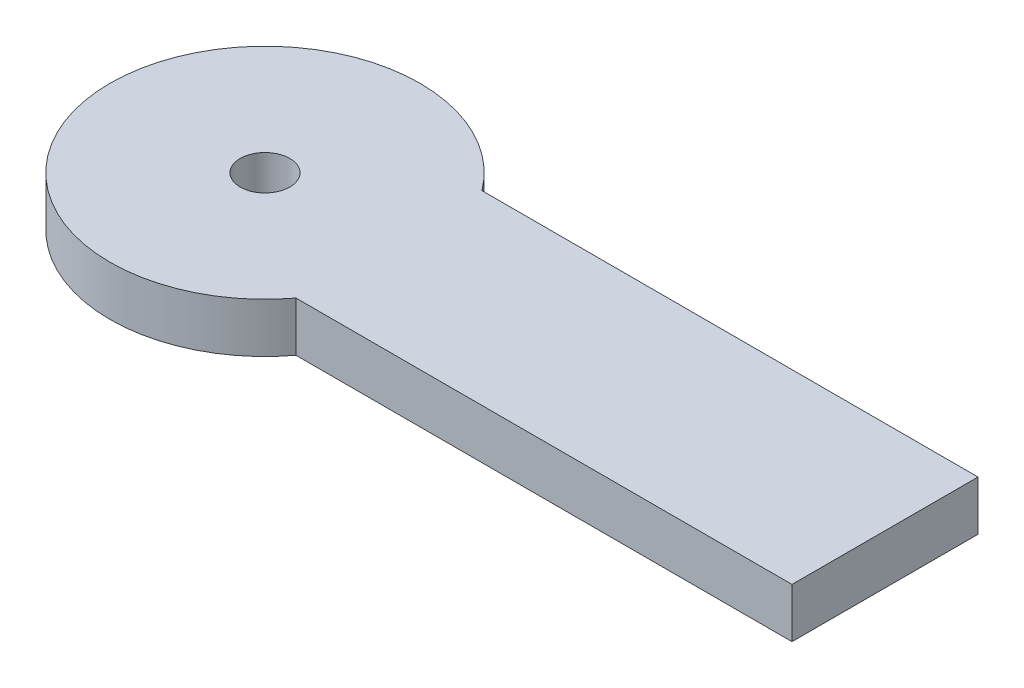
ISO-10303-21;
HEADER;
FILE_DESCRIPTION(('STEP AP214'),'2;1');
FILE_NAME('part.step','',(''),(''),'','','');
FILE_SCHEMA(('AUTOMOTIVE_DESIGN { 1 0 10303 214 1 1 1 1 }'));
ENDSEC;
DATA;
#1=APPLICATION_CONTEXT('core data for automotive mechanical design processes');
#2=APPLICATION_PROTOCOL_DEFINITION('international standard','automotive_design',2000,#1);
#3=PRODUCT_CONTEXT('',#1,'mechanical');
#4=PRODUCT('Part','Part','',(#3));
#5=PRODUCT_RELATED_PRODUCT_CATEGORY('part','',(#4));
#6=PRODUCT_DEFINITION_FORMATION('','',#4);
#7=PRODUCT_DEFINITION_CONTEXT('part definition',#1,'design');
#8=PRODUCT_DEFINITION('design','',#6,#7);
#9=PRODUCT_DEFINITION_SHAPE('','',#8);
#10=(LENGTH_UNIT() NAMED_UNIT(*) SI_UNIT(.MILLI.,.METRE.));
#11=(NAMED_UNIT(*) PLANE_ANGLE_UNIT() SI_UNIT($,.RADIAN.));
#12=(NAMED_UNIT(*) SI_UNIT($,.STERADIAN.) SOLID_ANGLE_UNIT());
#13=UNCERTAINTY_MEASURE_WITH_UNIT(LENGTH_MEASURE(1.E-05),#10,'distance_accuracy_value','');
#14=(GEOMETRIC_REPRESENTATION_CONTEXT(3) GLOBAL_UNCERTAINTY_ASSIGNED_CONTEXT((#13)) GLOBAL_UNIT_ASSIGNED_CONTEXT((#10,
#11,#12)) REPRESENTATION_CONTEXT('',''));
#15=CARTESIAN_POINT('',(0.,0.,0.));
#16=DIRECTION('',(0.,0.,1.));
#17=DIRECTION('',(1.,0.,0.));
#18=AXIS2_PLACEMENT_3D('',#15,#16,#17);
#19=CARTESIAN_POINT('',(0.,4.,0.));
#20=DIRECTION('',(0.,1.,0.));
#21=DIRECTION('',(0.,0.,1.));
#22=AXIS2_PLACEMENT_3D('',#19,#20,#21);
#23=PLANE('',#22);
#24=CARTESIAN_POINT('',(0.,4.,0.));
#25=DIRECTION('',(0.,1.,0.));
#26=DIRECTION('',(0.,0.,1.));
#27=AXIS2_PLACEMENT_3D('',#24,#25,#26);
#28=CIRCLE('',#27,12.5);
#29=CARTESIAN_POINT('',(10.,4.,-7.5));
#30=VERTEX_POINT('',#29);
#31=CARTESIAN_POINT('',(10.,4.,7.5));
#32=VERTEX_POINT('',#31);
#33=EDGE_CURVE('E87',#30,#32,#28,.T.);
#34=ORIENTED_EDGE('',*,*,#33,.T.);
#35=DIRECTION('',(1.,0.,0.));
#36=VECTOR('',#35,1.);
#37=CARTESIAN_POINT('',(50.,4.,7.5));
#38=LINE('',#37,#36);
#39=CARTESIAN_POINT('',(50.,4.,7.5));
#40=VERTEX_POINT('',#39);
#41=EDGE_CURVE('E82',#32,#40,#38,.T.);
#42=ORIENTED_EDGE('',*,*,#41,.T.);
#43=DIRECTION('',(0.,0.,-1.));
#44=VECTOR('',#43,1.);
#45=CARTESIAN_POINT('',(50.,4.,-7.5));
#46=LINE('',#45,#44);
#47=CARTESIAN_POINT('',(50.,4.,-7.5));
#48=VERTEX_POINT('',#47);
#49=EDGE_CURVE('E85',#40,#48,#46,.T.);
#50=ORIENTED_EDGE('',*,*,#49,.T.);
#51=DIRECTION('',(-1.,0.,0.));
#52=VECTOR('',#51,1.);
#53=CARTESIAN_POINT('',(10.,4.,-7.5));
#54=LINE('',#53,#52);
#55=EDGE_CURVE('E52',#48,#30,#54,.T.);
#56=ORIENTED_EDGE('',*,*,#55,.T.);
#57=EDGE_LOOP('',(#34,#42,#50,#56));
#58=FACE_BOUND('',#57,.T.);
#59=CARTESIAN_POINT('',(0.,4.,0.));
#60=DIRECTION('',(0.,1.,0.));
#61=DIRECTION('',(0.,0.,1.));
#62=AXIS2_PLACEMENT_3D('',#59,#60,#61);
#63=CIRCLE('',#62,2.);
#64=CARTESIAN_POINT('',(0.,4.,2.));
#65=VERTEX_POINT('',#64);
#66=EDGE_CURVE('E102',#65,#65,#63,.T.);
#67=ORIENTED_EDGE('',*,*,#66,.F.);
#68=EDGE_LOOP('',(#67));
#69=FACE_BOUND('',#68,.T.);
#70=ADVANCED_FACE('F35',(#58,#69),#23,.T.);
#71=CARTESIAN_POINT('',(0.,0.,0.));
#72=DIRECTION('',(0.,1.,0.));
#73=DIRECTION('',(0.,0.,1.));
#74=AXIS2_PLACEMENT_3D('',#71,#72,#73);
#75=PLANE('',#74);
#76=CARTESIAN_POINT('',(0.,0.,0.));
#77=DIRECTION('',(0.,1.,0.));
#78=DIRECTION('',(0.,0.,1.));
#79=AXIS2_PLACEMENT_3D('',#76,#77,#78);
#80=CIRCLE('',#79,12.5);
#81=CARTESIAN_POINT('',(10.,0.,-7.5));
#82=VERTEX_POINT('',#81);
#83=CARTESIAN_POINT('',(10.,0.,7.5));
#84=VERTEX_POINT('',#83);
#85=EDGE_CURVE('E99',#82,#84,#80,.T.);
#86=ORIENTED_EDGE('',*,*,#85,.F.);
#87=DIRECTION('',(-1.,0.,0.));
#88=VECTOR('',#87,1.);
#89=CARTESIAN_POINT('',(10.,0.,-7.5));
#90=LINE('',#89,#88);
#91=CARTESIAN_POINT('',(50.,0.,-7.5));
#92=VERTEX_POINT('',#91);
#93=EDGE_CURVE('E75',#92,#82,#90,.T.);
#94=ORIENTED_EDGE('',*,*,#93,.F.);
#95=DIRECTION('',(0.,0.,-1.));
#96=VECTOR('',#95,1.);
#97=CARTESIAN_POINT('',(50.,0.,-7.5));
#98=LINE('',#97,#96);
#99=CARTESIAN_POINT('',(50.,0.,7.5));
#100=VERTEX_POINT('',#99);
#101=EDGE_CURVE('E69',#100,#92,#98,.T.);
#102=ORIENTED_EDGE('',*,*,#101,.F.);
#103=DIRECTION('',(1.,0.,0.));
#104=VECTOR('',#103,1.);
#105=CARTESIAN_POINT('',(50.,0.,7.5));
#106=LINE('',#105,#104);
#107=EDGE_CURVE('E91',#84,#100,#106,.T.);
#108=ORIENTED_EDGE('',*,*,#107,.F.);
#109=EDGE_LOOP('',(#86,#94,#102,#108));
#110=FACE_BOUND('',#109,.T.);
#111=CARTESIAN_POINT('',(0.,0.,0.));
#112=DIRECTION('',(0.,1.,0.));
#113=DIRECTION('',(0.,0.,1.));
#114=AXIS2_PLACEMENT_3D('',#111,#112,#113);
#115=CIRCLE('',#114,2.);
#116=CARTESIAN_POINT('',(0.,0.,2.));
#117=VERTEX_POINT('',#116);
#118=EDGE_CURVE('E114',#117,#117,#115,.T.);
#119=ORIENTED_EDGE('',*,*,#118,.T.);
#120=EDGE_LOOP('',(#119));
#121=FACE_BOUND('',#120,.T.);
#122=ADVANCED_FACE('F110',(#110,#121),#75,.F.);
#123=CARTESIAN_POINT('',(0.,4.,0.));
#124=DIRECTION('',(0.,-1.,0.));
#125=DIRECTION('',(0.,0.,-1.));
#126=AXIS2_PLACEMENT_3D('',#123,#124,#125);
#127=CYLINDRICAL_SURFACE('',#126,12.5);
#128=ORIENTED_EDGE('',*,*,#85,.T.);
#129=DIRECTION('',(0.,-1.,0.));
#130=VECTOR('',#129,1.);
#131=CARTESIAN_POINT('',(10.,4.,7.5));
#132=LINE('',#131,#130);
#133=EDGE_CURVE('E11',#32,#84,#132,.T.);
#134=ORIENTED_EDGE('',*,*,#133,.F.);
#135=ORIENTED_EDGE('',*,*,#33,.F.);
#136=DIRECTION('',(0.,-1.,0.));
#137=VECTOR('',#136,1.);
#138=CARTESIAN_POINT('',(10.,4.,-7.5));
#139=LINE('',#138,#137);
#140=EDGE_CURVE('E95',#30,#82,#139,.T.);
#141=ORIENTED_EDGE('',*,*,#140,.T.);
#142=EDGE_LOOP('',(#128,#134,#135,#141));
#143=FACE_BOUND('',#142,.T.);
#144=ADVANCED_FACE('F37',(#143),#127,.T.);
#145=CARTESIAN_POINT('',(50.,4.,7.5));
#146=DIRECTION('',(0.,0.,-1.));
#147=DIRECTION('',(-1.,0.,0.));
#148=AXIS2_PLACEMENT_3D('',#145,#146,#147);
#149=PLANE('',#148);
#150=ORIENTED_EDGE('',*,*,#107,.T.);
#151=DIRECTION('',(0.,-1.,0.));
#152=VECTOR('',#151,1.);
#153=CARTESIAN_POINT('',(50.,4.,7.5));
#154=LINE('',#153,#152);
#155=EDGE_CURVE('E44',#40,#100,#154,.T.);
#156=ORIENTED_EDGE('',*,*,#155,.F.);
#157=ORIENTED_EDGE('',*,*,#41,.F.);
#158=ORIENTED_EDGE('',*,*,#133,.T.);
#159=EDGE_LOOP('',(#150,#156,#157,#158));
#160=FACE_BOUND('',#159,.T.);
#161=ADVANCED_FACE('F90',(#160),#149,.F.);
#162=CARTESIAN_POINT('',(50.,4.,-7.5));
#163=DIRECTION('',(-1.,0.,0.));
#164=DIRECTION('',(0.,0.,1.));
#165=AXIS2_PLACEMENT_3D('',#162,#163,#164);
#166=PLANE('',#165);
#167=ORIENTED_EDGE('',*,*,#101,.T.);
#168=DIRECTION('',(0.,-1.,0.));
#169=VECTOR('',#168,1.);
#170=CARTESIAN_POINT('',(50.,4.,-7.5));
#171=LINE('',#170,#169);
#172=EDGE_CURVE('E92',#48,#92,#171,.T.);
#173=ORIENTED_EDGE('',*,*,#172,.F.);
#174=ORIENTED_EDGE('',*,*,#49,.F.);
#175=ORIENTED_EDGE('',*,*,#155,.T.);
#176=EDGE_LOOP('',(#167,#173,#174,#175));
#177=FACE_BOUND('',#176,.T.);
#178=ADVANCED_FACE('F93',(#177),#166,.F.);
#179=CARTESIAN_POINT('',(10.,4.,-7.5));
#180=DIRECTION('',(0.,0.,1.));
#181=DIRECTION('',(1.,0.,0.));
#182=AXIS2_PLACEMENT_3D('',#179,#180,#181);
#183=PLANE('',#182);
#184=ORIENTED_EDGE('',*,*,#93,.T.);
#185=ORIENTED_EDGE('',*,*,#140,.F.);
#186=ORIENTED_EDGE('',*,*,#55,.F.);
#187=ORIENTED_EDGE('',*,*,#172,.T.);
#188=EDGE_LOOP('',(#184,#185,#186,#187));
#189=FACE_BOUND('',#188,.T.);
#190=ADVANCED_FACE('F107',(#189),#183,.F.);
#191=CARTESIAN_POINT('',(0.,4.,0.));
#192=DIRECTION('',(0.,-1.,0.));
#193=DIRECTION('',(0.,0.,-1.));
#194=AXIS2_PLACEMENT_3D('',#191,#192,#193);
#195=CYLINDRICAL_SURFACE('',#194,2.);
#196=ORIENTED_EDGE('',*,*,#66,.T.);
#197=EDGE_LOOP('',(#196));
#198=FACE_BOUND('',#197,.T.);
#199=ORIENTED_EDGE('',*,*,#118,.F.);
#200=EDGE_LOOP('',(#199));
#201=FACE_BOUND('',#200,.T.);
#202=ADVANCED_FACE('F120',(#198,#201),#195,.F.);
#203=CLOSED_SHELL('',(#70,#122,#144,#161,#178,#190,#202));
#204=MANIFOLD_SOLID_BREP('B2',#203);
#205=ADVANCED_BREP_SHAPE_REPRESENTATION('',(#18,#204),#14);
#206=SHAPE_DEFINITION_REPRESENTATION(#9,#205);
ENDSEC;
END-ISO-10303-21;
